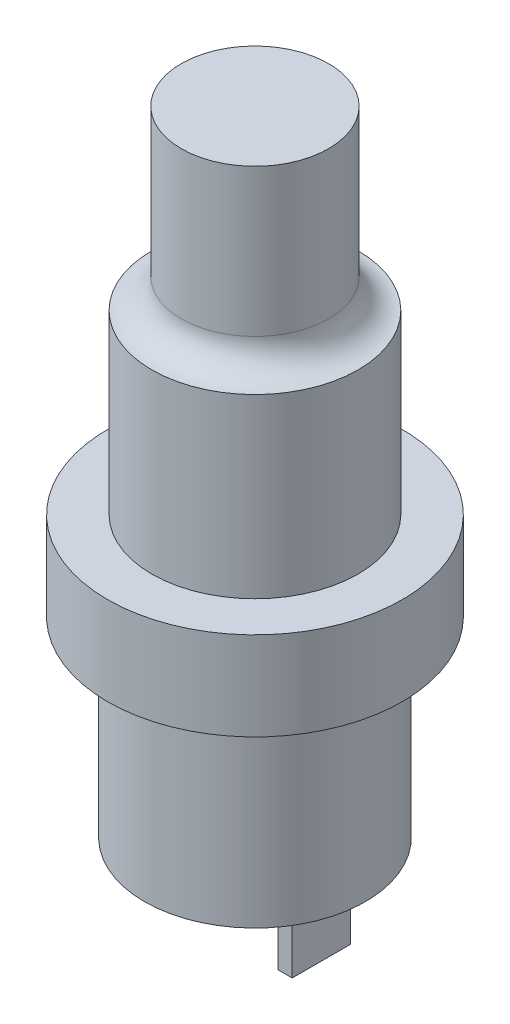
ISO-10303-21;
HEADER;
FILE_DESCRIPTION(('STEP AP214'),'2;1');
FILE_NAME('part.step','',(''),(''),'','','');
FILE_SCHEMA(('AUTOMOTIVE_DESIGN { 1 0 10303 214 1 1 1 1 }'));
ENDSEC;
DATA;
#1=APPLICATION_CONTEXT('core data for automotive mechanical design processes');
#2=APPLICATION_PROTOCOL_DEFINITION('international standard','automotive_design',2000,#1);
#3=PRODUCT_CONTEXT('',#1,'mechanical');
#4=PRODUCT('Part','Part','',(#3));
#5=PRODUCT_RELATED_PRODUCT_CATEGORY('part','',(#4));
#6=PRODUCT_DEFINITION_FORMATION('','',#4);
#7=PRODUCT_DEFINITION_CONTEXT('part definition',#1,'design');
#8=PRODUCT_DEFINITION('design','',#6,#7);
#9=PRODUCT_DEFINITION_SHAPE('','',#8);
#10=(LENGTH_UNIT() NAMED_UNIT(*) SI_UNIT(.MILLI.,.METRE.));
#11=(NAMED_UNIT(*) PLANE_ANGLE_UNIT() SI_UNIT($,.RADIAN.));
#12=(NAMED_UNIT(*) SI_UNIT($,.STERADIAN.) SOLID_ANGLE_UNIT());
#13=UNCERTAINTY_MEASURE_WITH_UNIT(LENGTH_MEASURE(1.E-05),#10,'distance_accuracy_value','');
#14=(GEOMETRIC_REPRESENTATION_CONTEXT(3) GLOBAL_UNCERTAINTY_ASSIGNED_CONTEXT((#13)) GLOBAL_UNIT_ASSIGNED_CONTEXT((#10,
#11,#12)) REPRESENTATION_CONTEXT('',''));
#15=CARTESIAN_POINT('',(0.,0.,0.));
#16=DIRECTION('',(0.,0.,1.));
#17=DIRECTION('',(1.,0.,0.));
#18=AXIS2_PLACEMENT_3D('',#15,#16,#17);
#19=CARTESIAN_POINT('',(0.,0.,0.));
#20=DIRECTION('',(0.,1.,0.));
#21=DIRECTION('',(0.,0.,1.));
#22=AXIS2_PLACEMENT_3D('',#19,#20,#21);
#23=PLANE('',#22);
#24=DIRECTION('',(0.,0.,1.));
#25=VECTOR('',#24,1.);
#26=CARTESIAN_POINT('',(-1.76643282023339,0.,0.985733097216471));
#27=LINE('',#26,#25);
#28=CARTESIAN_POINT('',(-1.76643282023339,0.,-0.985733097216471));
#29=VERTEX_POINT('',#28);
#30=CARTESIAN_POINT('',(-1.76643282023339,0.,0.985733097216471));
#31=VERTEX_POINT('',#30);
#32=EDGE_CURVE('E163',#29,#31,#27,.T.);
#33=ORIENTED_EDGE('',*,*,#32,.F.);
#34=DIRECTION('',(1.,0.,0.));
#35=VECTOR('',#34,1.);
#36=CARTESIAN_POINT('',(-1.76643282023339,0.,-0.985733097216471));
#37=LINE('',#36,#35);
#38=CARTESIAN_POINT('',(-2.25,0.,-0.985733097216471));
#39=VERTEX_POINT('',#38);
#40=EDGE_CURVE('E153',#39,#29,#37,.T.);
#41=ORIENTED_EDGE('',*,*,#40,.F.);
#42=DIRECTION('',(0.,0.,-1.));
#43=VECTOR('',#42,1.);
#44=CARTESIAN_POINT('',(-2.25,0.,0.985733097216471));
#45=LINE('',#44,#43);
#46=CARTESIAN_POINT('',(-2.25,0.,0.985733097216471));
#47=VERTEX_POINT('',#46);
#48=EDGE_CURVE('E156',#47,#39,#45,.T.);
#49=ORIENTED_EDGE('',*,*,#48,.F.);
#50=DIRECTION('',(-1.,0.,0.));
#51=VECTOR('',#50,1.);
#52=CARTESIAN_POINT('',(-1.76643282023339,0.,0.985733097216471));
#53=LINE('',#52,#51);
#54=EDGE_CURVE('E160',#31,#47,#53,.T.);
#55=ORIENTED_EDGE('',*,*,#54,.F.);
#56=EDGE_LOOP('',(#33,#41,#49,#55));
#57=FACE_BOUND('',#56,.T.);
#58=CARTESIAN_POINT('',(0.,0.,0.));
#59=DIRECTION('',(0.,1.,0.));
#60=DIRECTION('',(0.,0.,1.));
#61=AXIS2_PLACEMENT_3D('',#58,#59,#60);
#62=CIRCLE('',#61,3.75);
#63=CARTESIAN_POINT('',(0.,0.,-3.75));
#64=VERTEX_POINT('',#63);
#65=EDGE_CURVE('E182',#64,#64,#62,.T.);
#66=ORIENTED_EDGE('',*,*,#65,.F.);
#67=EDGE_LOOP('',(#66));
#68=FACE_BOUND('',#67,.T.);
#69=DIRECTION('',(0.,0.,1.));
#70=VECTOR('',#69,1.);
#71=CARTESIAN_POINT('',(2.25,0.,0.985733097216471));
#72=LINE('',#71,#70);
#73=CARTESIAN_POINT('',(2.25,0.,-0.985733097216471));
#74=VERTEX_POINT('',#73);
#75=CARTESIAN_POINT('',(2.25,0.,0.985733097216471));
#76=VERTEX_POINT('',#75);
#77=EDGE_CURVE('E130',#74,#76,#72,.T.);
#78=ORIENTED_EDGE('',*,*,#77,.F.);
#79=DIRECTION('',(1.,0.,0.));
#80=VECTOR('',#79,1.);
#81=CARTESIAN_POINT('',(1.76643282023339,0.,-0.985733097216471));
#82=LINE('',#81,#80);
#83=CARTESIAN_POINT('',(1.76643282023339,0.,-0.985733097216471));
#84=VERTEX_POINT('',#83);
#85=EDGE_CURVE('E127',#84,#74,#82,.T.);
#86=ORIENTED_EDGE('',*,*,#85,.F.);
#87=DIRECTION('',(0.,0.,-1.));
#88=VECTOR('',#87,1.);
#89=CARTESIAN_POINT('',(1.76643282023339,0.,0.985733097216471));
#90=LINE('',#89,#88);
#91=CARTESIAN_POINT('',(1.76643282023339,0.,0.985733097216471));
#92=VERTEX_POINT('',#91);
#93=EDGE_CURVE('E65',#92,#84,#90,.T.);
#94=ORIENTED_EDGE('',*,*,#93,.F.);
#95=DIRECTION('',(-1.,0.,0.));
#96=VECTOR('',#95,1.);
#97=CARTESIAN_POINT('',(1.76643282023339,0.,0.985733097216471));
#98=LINE('',#97,#96);
#99=EDGE_CURVE('E60',#76,#92,#98,.T.);
#100=ORIENTED_EDGE('',*,*,#99,.F.);
#101=EDGE_LOOP('',(#78,#86,#94,#100));
#102=FACE_BOUND('',#101,.T.);
#103=ADVANCED_FACE('F45',(#57,#68,#102),#23,.F.);
#104=CARTESIAN_POINT('',(0.,6.5,0.));
#105=DIRECTION('',(0.,-1.,0.));
#106=DIRECTION('',(0.,0.,-1.));
#107=AXIS2_PLACEMENT_3D('',#104,#105,#106);
#108=CYLINDRICAL_SURFACE('',#107,3.75);
#109=CARTESIAN_POINT('',(0.,6.5,0.));
#110=DIRECTION('',(0.,1.,0.));
#111=DIRECTION('',(0.,0.,1.));
#112=AXIS2_PLACEMENT_3D('',#109,#110,#111);
#113=CIRCLE('',#112,3.75);
#114=CARTESIAN_POINT('',(0.,6.5,-3.75));
#115=VERTEX_POINT('',#114);
#116=EDGE_CURVE('E178',#115,#115,#113,.T.);
#117=CARTESIAN_POINT('',(0.,6.5,-3.75));
#118=CARTESIAN_POINT('',(0.,6.43229166666667,-3.75));
#119=CARTESIAN_POINT('',(0.,6.36458333333333,-3.75));
#120=CARTESIAN_POINT('',(0.,6.22916666666667,-3.75));
#121=CARTESIAN_POINT('',(0.,6.16145833333333,-3.75));
#122=CARTESIAN_POINT('',(0.,6.02604166666667,-3.75));
#123=CARTESIAN_POINT('',(0.,5.95833333333333,-3.75));
#124=CARTESIAN_POINT('',(0.,5.82291666666667,-3.75));
#125=CARTESIAN_POINT('',(0.,5.75520833333333,-3.75));
#126=CARTESIAN_POINT('',(0.,5.61979166666667,-3.75));
#127=CARTESIAN_POINT('',(0.,5.55208333333333,-3.75));
#128=CARTESIAN_POINT('',(0.,5.41666666666667,-3.75));
#129=CARTESIAN_POINT('',(0.,5.34895833333333,-3.75));
#130=CARTESIAN_POINT('',(0.,5.21354166666667,-3.75));
#131=CARTESIAN_POINT('',(0.,5.14583333333333,-3.75));
#132=CARTESIAN_POINT('',(0.,5.01041666666667,-3.75));
#133=CARTESIAN_POINT('',(0.,4.94270833333333,-3.75));
#134=CARTESIAN_POINT('',(0.,4.80729166666667,-3.75));
#135=CARTESIAN_POINT('',(0.,4.73958333333333,-3.75));
#136=CARTESIAN_POINT('',(0.,4.60416666666667,-3.75));
#137=CARTESIAN_POINT('',(0.,4.53645833333333,-3.75));
#138=CARTESIAN_POINT('',(0.,4.40104166666667,-3.75));
#139=CARTESIAN_POINT('',(0.,4.33333333333333,-3.75));
#140=CARTESIAN_POINT('',(0.,4.19791666666667,-3.75));
#141=CARTESIAN_POINT('',(0.,4.13020833333333,-3.75));
#142=CARTESIAN_POINT('',(0.,3.99479166666667,-3.75));
#143=CARTESIAN_POINT('',(0.,3.92708333333333,-3.75));
#144=CARTESIAN_POINT('',(0.,3.79166666666667,-3.75));
#145=CARTESIAN_POINT('',(0.,3.72395833333333,-3.75));
#146=CARTESIAN_POINT('',(0.,3.58854166666667,-3.75));
#147=CARTESIAN_POINT('',(0.,3.52083333333333,-3.75));
#148=CARTESIAN_POINT('',(0.,3.38541666666667,-3.75));
#149=CARTESIAN_POINT('',(0.,3.31770833333333,-3.75));
#150=CARTESIAN_POINT('',(0.,3.18229166666667,-3.75));
#151=CARTESIAN_POINT('',(0.,3.11458333333333,-3.75));
#152=CARTESIAN_POINT('',(0.,2.97916666666667,-3.75));
#153=CARTESIAN_POINT('',(0.,2.91145833333333,-3.75));
#154=CARTESIAN_POINT('',(0.,2.77604166666667,-3.75));
#155=CARTESIAN_POINT('',(0.,2.70833333333333,-3.75));
#156=CARTESIAN_POINT('',(0.,2.57291666666667,-3.75));
#157=CARTESIAN_POINT('',(0.,2.50520833333333,-3.75));
#158=CARTESIAN_POINT('',(0.,2.36979166666667,-3.75));
#159=CARTESIAN_POINT('',(0.,2.30208333333333,-3.75));
#160=CARTESIAN_POINT('',(0.,2.16666666666667,-3.75));
#161=CARTESIAN_POINT('',(0.,2.09895833333333,-3.75));
#162=CARTESIAN_POINT('',(0.,1.96354166666667,-3.75));
#163=CARTESIAN_POINT('',(0.,1.89583333333333,-3.75));
#164=CARTESIAN_POINT('',(0.,1.76041666666667,-3.75));
#165=CARTESIAN_POINT('',(0.,1.69270833333333,-3.75));
#166=CARTESIAN_POINT('',(0.,1.55729166666667,-3.75));
#167=CARTESIAN_POINT('',(0.,1.48958333333333,-3.75));
#168=CARTESIAN_POINT('',(0.,1.35416666666667,-3.75));
#169=CARTESIAN_POINT('',(0.,1.28645833333333,-3.75));
#170=CARTESIAN_POINT('',(0.,1.15104166666667,-3.75));
#171=CARTESIAN_POINT('',(0.,1.08333333333333,-3.75));
#172=CARTESIAN_POINT('',(0.,0.947916666666667,-3.75));
#173=CARTESIAN_POINT('',(0.,0.880208333333333,-3.75));
#174=CARTESIAN_POINT('',(0.,0.744791666666667,-3.75));
#175=CARTESIAN_POINT('',(0.,0.677083333333333,-3.75));
#176=CARTESIAN_POINT('',(0.,0.541666666666667,-3.75));
#177=CARTESIAN_POINT('',(0.,0.473958333333333,-3.75));
#178=CARTESIAN_POINT('',(0.,0.338541666666667,-3.75));
#179=CARTESIAN_POINT('',(0.,0.270833333333334,-3.75));
#180=CARTESIAN_POINT('',(0.,0.135416666666667,-3.75));
#181=CARTESIAN_POINT('',(0.,0.0677083333333334,-3.75));
#182=CARTESIAN_POINT('',(0.,0.,-3.75));
#183=B_SPLINE_CURVE_WITH_KNOTS('',3,(#117,#118,#119,#120,#121,#122,#123,#124,#125,#126,#127,
#128,#129,#130,#131,#132,#133,#134,#135,#136,#137,#138,#139,#140,#141,#142,#143,#144,#145,#146,
#147,#148,#149,#150,#151,#152,#153,#154,#155,#156,#157,#158,#159,#160,#161,#162,#163,#164,#165,
#166,#167,#168,#169,#170,#171,#172,#173,#174,#175,#176,#177,#178,#179,#180,#181,#182),
.UNSPECIFIED.,.F.,.F.,(4,2,2,2,2,2,2,2,2,2,2,2,2,2,2,2,2,2,2,2,2,2,2,2,2,2,2,2,2,2,2,2,4),(0.,
0.203125,0.40625,0.609375000000001,0.812500000000001,1.015625,1.21875,1.421875,1.625,1.828125,
2.03125,2.234375,2.4375,2.640625,2.84375,3.046875,3.25,3.453125,3.65625,3.859375,4.0625,
4.265625,4.46875,4.671875,4.875,5.078125,5.28125,5.484375,5.6875,5.890625,6.09375,6.296875,6.5),.UNSPECIFIED.);
#184=EDGE_CURVE('BSEAM189',#115,#64,#183,.T.);
#185=ORIENTED_EDGE('',*,*,#116,.F.);
#186=ORIENTED_EDGE('',*,*,#65,.T.);
#187=ORIENTED_EDGE('',*,*,#184,.T.);
#188=ORIENTED_EDGE('',*,*,#184,.F.);
#189=EDGE_LOOP('',(#185,#187,#186,#188));
#190=FACE_BOUND('',#189,.T.);
#191=ADVANCED_FACE('F189',(#190),#108,.T.);
#192=CARTESIAN_POINT('',(0.,9.5,0.));
#193=DIRECTION('',(0.,-1.,0.));
#194=DIRECTION('',(0.,0.,-1.));
#195=AXIS2_PLACEMENT_3D('',#192,#193,#194);
#196=CYLINDRICAL_SURFACE('',#195,5.);
#197=CARTESIAN_POINT('',(0.,9.5,0.));
#198=DIRECTION('',(0.,1.,0.));
#199=DIRECTION('',(0.,0.,1.));
#200=AXIS2_PLACEMENT_3D('',#197,#198,#199);
#201=CIRCLE('',#200,5.);
#202=CARTESIAN_POINT('',(0.,9.5,5.));
#203=VERTEX_POINT('',#202);
#204=EDGE_CURVE('E179',#203,#203,#201,.T.);
#205=ORIENTED_EDGE('',*,*,#204,.F.);
#206=EDGE_LOOP('',(#205));
#207=FACE_BOUND('',#206,.T.);
#208=CARTESIAN_POINT('',(0.,6.5,0.));
#209=DIRECTION('',(0.,1.,0.));
#210=DIRECTION('',(0.,0.,1.));
#211=AXIS2_PLACEMENT_3D('',#208,#209,#210);
#212=CIRCLE('',#211,5.);
#213=CARTESIAN_POINT('',(0.,6.5,5.));
#214=VERTEX_POINT('',#213);
#215=EDGE_CURVE('E175',#214,#214,#212,.T.);
#216=ORIENTED_EDGE('',*,*,#215,.T.);
#217=EDGE_LOOP('',(#216));
#218=FACE_BOUND('',#217,.T.);
#219=ADVANCED_FACE('F257',(#207,#218),#196,.T.);
#220=CARTESIAN_POINT('',(0.,9.5,0.));
#221=DIRECTION('',(0.,1.,0.));
#222=DIRECTION('',(0.,0.,1.));
#223=AXIS2_PLACEMENT_3D('',#220,#221,#222);
#224=PLANE('',#223);
#225=CARTESIAN_POINT('',(0.,9.5,0.));
#226=DIRECTION('',(0.,1.,0.));
#227=DIRECTION('',(0.,0.,1.));
#228=AXIS2_PLACEMENT_3D('',#225,#226,#227);
#229=CIRCLE('',#228,3.5);
#230=CARTESIAN_POINT('',(0.,9.5,3.5));
#231=VERTEX_POINT('',#230);
#232=EDGE_CURVE('E53',#231,#231,#229,.T.);
#233=ORIENTED_EDGE('',*,*,#232,.F.);
#234=EDGE_LOOP('',(#233));
#235=FACE_BOUND('',#234,.T.);
#236=ORIENTED_EDGE('',*,*,#204,.T.);
#237=EDGE_LOOP('',(#236));
#238=FACE_BOUND('',#237,.T.);
#239=ADVANCED_FACE('F254',(#235,#238),#224,.T.);
#240=CARTESIAN_POINT('',(0.,6.5,0.));
#241=DIRECTION('',(0.,1.,0.));
#242=DIRECTION('',(0.,0.,1.));
#243=AXIS2_PLACEMENT_3D('',#240,#241,#242);
#244=PLANE('',#243);
#245=ORIENTED_EDGE('',*,*,#116,.T.);
#246=EDGE_LOOP('',(#245));
#247=FACE_BOUND('',#246,.T.);
#248=ORIENTED_EDGE('',*,*,#215,.F.);
#249=EDGE_LOOP('',(#248));
#250=FACE_BOUND('',#249,.T.);
#251=ADVANCED_FACE('F252',(#247,#250),#244,.F.);
#252=CARTESIAN_POINT('',(0.,15.5,0.));
#253=DIRECTION('',(0.,-1.,0.));
#254=DIRECTION('',(0.,0.,-1.));
#255=AXIS2_PLACEMENT_3D('',#252,#253,#254);
#256=CYLINDRICAL_SURFACE('',#255,3.5);
#257=CARTESIAN_POINT('',(0.,15.5,0.));
#258=DIRECTION('',(0.,1.,0.));
#259=DIRECTION('',(0.,0.,1.));
#260=AXIS2_PLACEMENT_3D('',#257,#258,#259);
#261=CIRCLE('',#260,3.5);
#262=CARTESIAN_POINT('',(0.,15.5,3.5));
#263=VERTEX_POINT('',#262);
#264=EDGE_CURVE('E134',#263,#263,#261,.T.);
#265=ORIENTED_EDGE('',*,*,#264,.F.);
#266=EDGE_LOOP('',(#265));
#267=FACE_BOUND('',#266,.T.);
#268=ORIENTED_EDGE('',*,*,#232,.T.);
#269=EDGE_LOOP('',(#268));
#270=FACE_BOUND('',#269,.T.);
#271=ADVANCED_FACE('F248',(#267,#270),#256,.T.);
#272=CARTESIAN_POINT('',(0.,21.5,0.));
#273=DIRECTION('',(0.,-1.,0.));
#274=DIRECTION('',(0.,0.,-1.));
#275=AXIS2_PLACEMENT_3D('',#272,#273,#274);
#276=CYLINDRICAL_SURFACE('',#275,2.5);
#277=CARTESIAN_POINT('',(0.,16.5,0.));
#278=DIRECTION('',(0.,1.,0.));
#279=DIRECTION('',(0.,0.,1.));
#280=AXIS2_PLACEMENT_3D('',#277,#278,#279);
#281=CIRCLE('',#280,2.5);
#282=CARTESIAN_POINT('',(0.,16.5,2.5));
#283=VERTEX_POINT('',#282);
#284=EDGE_CURVE('E11',#283,#283,#281,.T.);
#285=ORIENTED_EDGE('',*,*,#284,.T.);
#286=EDGE_LOOP('',(#285));
#287=FACE_BOUND('',#286,.T.);
#288=CARTESIAN_POINT('',(0.,21.5,0.));
#289=DIRECTION('',(0.,1.,0.));
#290=DIRECTION('',(0.,0.,1.));
#291=AXIS2_PLACEMENT_3D('',#288,#289,#290);
#292=CIRCLE('',#291,2.5);
#293=CARTESIAN_POINT('',(0.,21.5,2.5));
#294=VERTEX_POINT('',#293);
#295=EDGE_CURVE('E131',#294,#294,#292,.T.);
#296=ORIENTED_EDGE('',*,*,#295,.F.);
#297=EDGE_LOOP('',(#296));
#298=FACE_BOUND('',#297,.T.);
#299=ADVANCED_FACE('F244',(#287,#298),#276,.T.);
#300=CARTESIAN_POINT('',(0.,21.5,0.));
#301=DIRECTION('',(0.,1.,0.));
#302=DIRECTION('',(0.,0.,1.));
#303=AXIS2_PLACEMENT_3D('',#300,#301,#302);
#304=PLANE('',#303);
#305=ORIENTED_EDGE('',*,*,#295,.T.);
#306=EDGE_LOOP('',(#305));
#307=FACE_BOUND('',#306,.T.);
#308=ADVANCED_FACE('F241',(#307),#304,.T.);
#309=CARTESIAN_POINT('',(0.,16.5,0.));
#310=DIRECTION('',(0.,1.,0.));
#311=DIRECTION('',(0.,0.,1.));
#312=AXIS2_PLACEMENT_3D('',#309,#310,#311);
#313=TOROIDAL_SURFACE('',#312,3.5,1.);
#314=ORIENTED_EDGE('',*,*,#264,.T.);
#315=EDGE_LOOP('',(#314));
#316=FACE_BOUND('',#315,.T.);
#317=ORIENTED_EDGE('',*,*,#284,.F.);
#318=EDGE_LOOP('',(#317));
#319=FACE_BOUND('',#318,.T.);
#320=ADVANCED_FACE('F47',(#316,#319),#313,.F.);
#321=CARTESIAN_POINT('',(-1.76643282023339,-2.5,0.985733097216471));
#322=DIRECTION('',(-1.,0.,0.));
#323=DIRECTION('',(0.,0.,1.));
#324=AXIS2_PLACEMENT_3D('',#321,#322,#323);
#325=PLANE('',#324);
#326=ORIENTED_EDGE('',*,*,#32,.T.);
#327=DIRECTION('',(0.,1.,0.));
#328=VECTOR('',#327,1.);
#329=CARTESIAN_POINT('',(-1.76643282023339,-2.5,0.985733097216471));
#330=LINE('',#329,#328);
#331=CARTESIAN_POINT('',(-1.76643282023339,-2.5,0.985733097216471));
#332=VERTEX_POINT('',#331);
#333=EDGE_CURVE('E140',#332,#31,#330,.T.);
#334=ORIENTED_EDGE('',*,*,#333,.F.);
#335=DIRECTION('',(0.,0.,1.));
#336=VECTOR('',#335,1.);
#337=CARTESIAN_POINT('',(-1.76643282023339,-2.5,0.985733097216471));
#338=LINE('',#337,#336);
#339=CARTESIAN_POINT('',(-1.76643282023339,-2.5,-0.985733097216471));
#340=VERTEX_POINT('',#339);
#341=EDGE_CURVE('E157',#340,#332,#338,.T.);
#342=ORIENTED_EDGE('',*,*,#341,.F.);
#343=DIRECTION('',(0.,1.,0.));
#344=VECTOR('',#343,1.);
#345=CARTESIAN_POINT('',(-1.76643282023339,-2.5,-0.985733097216471));
#346=LINE('',#345,#344);
#347=EDGE_CURVE('E149',#340,#29,#346,.T.);
#348=ORIENTED_EDGE('',*,*,#347,.T.);
#349=EDGE_LOOP('',(#326,#334,#342,#348));
#350=FACE_BOUND('',#349,.T.);
#351=ADVANCED_FACE('F222',(#350),#325,.F.);
#352=CARTESIAN_POINT('',(-1.76643282023339,-2.5,0.985733097216471));
#353=DIRECTION('',(0.,0.,-1.));
#354=DIRECTION('',(-1.,0.,0.));
#355=AXIS2_PLACEMENT_3D('',#352,#353,#354);
#356=PLANE('',#355);
#357=ORIENTED_EDGE('',*,*,#54,.T.);
#358=DIRECTION('',(0.,1.,0.));
#359=VECTOR('',#358,1.);
#360=CARTESIAN_POINT('',(-2.25,-2.5,0.985733097216471));
#361=LINE('',#360,#359);
#362=CARTESIAN_POINT('',(-2.25,-2.5,0.985733097216471));
#363=VERTEX_POINT('',#362);
#364=EDGE_CURVE('E143',#363,#47,#361,.T.);
#365=ORIENTED_EDGE('',*,*,#364,.F.);
#366=DIRECTION('',(-1.,0.,0.));
#367=VECTOR('',#366,1.);
#368=CARTESIAN_POINT('',(-1.76643282023339,-2.5,0.985733097216471));
#369=LINE('',#368,#367);
#370=EDGE_CURVE('E169',#332,#363,#369,.T.);
#371=ORIENTED_EDGE('',*,*,#370,.F.);
#372=ORIENTED_EDGE('',*,*,#333,.T.);
#373=EDGE_LOOP('',(#357,#365,#371,#372));
#374=FACE_BOUND('',#373,.T.);
#375=ADVANCED_FACE('F225',(#374),#356,.F.);
#376=CARTESIAN_POINT('',(-2.25,-2.5,0.985733097216471));
#377=DIRECTION('',(1.,0.,0.));
#378=DIRECTION('',(0.,0.,-1.));
#379=AXIS2_PLACEMENT_3D('',#376,#377,#378);
#380=PLANE('',#379);
#381=ORIENTED_EDGE('',*,*,#48,.T.);
#382=DIRECTION('',(0.,1.,0.));
#383=VECTOR('',#382,1.);
#384=CARTESIAN_POINT('',(-2.25,-2.5,-0.985733097216471));
#385=LINE('',#384,#383);
#386=CARTESIAN_POINT('',(-2.25,-2.5,-0.985733097216471));
#387=VERTEX_POINT('',#386);
#388=EDGE_CURVE('E146',#387,#39,#385,.T.);
#389=ORIENTED_EDGE('',*,*,#388,.F.);
#390=DIRECTION('',(0.,0.,-1.));
#391=VECTOR('',#390,1.);
#392=CARTESIAN_POINT('',(-2.25,-2.5,0.985733097216471));
#393=LINE('',#392,#391);
#394=EDGE_CURVE('E167',#363,#387,#393,.T.);
#395=ORIENTED_EDGE('',*,*,#394,.F.);
#396=ORIENTED_EDGE('',*,*,#364,.T.);
#397=EDGE_LOOP('',(#381,#389,#395,#396));
#398=FACE_BOUND('',#397,.T.);
#399=ADVANCED_FACE('F229',(#398),#380,.F.);
#400=CARTESIAN_POINT('',(-1.76643282023339,-2.5,-0.985733097216471));
#401=DIRECTION('',(0.,0.,1.));
#402=DIRECTION('',(1.,0.,0.));
#403=AXIS2_PLACEMENT_3D('',#400,#401,#402);
#404=PLANE('',#403);
#405=ORIENTED_EDGE('',*,*,#40,.T.);
#406=ORIENTED_EDGE('',*,*,#347,.F.);
#407=DIRECTION('',(1.,0.,0.));
#408=VECTOR('',#407,1.);
#409=CARTESIAN_POINT('',(-1.76643282023339,-2.5,-0.985733097216471));
#410=LINE('',#409,#408);
#411=EDGE_CURVE('E152',#387,#340,#410,.T.);
#412=ORIENTED_EDGE('',*,*,#411,.F.);
#413=ORIENTED_EDGE('',*,*,#388,.T.);
#414=EDGE_LOOP('',(#405,#406,#412,#413));
#415=FACE_BOUND('',#414,.T.);
#416=ADVANCED_FACE('F233',(#415),#404,.F.);
#417=CARTESIAN_POINT('',(0.,-2.5,0.));
#418=DIRECTION('',(0.,1.,0.));
#419=DIRECTION('',(0.,0.,1.));
#420=AXIS2_PLACEMENT_3D('',#417,#418,#419);
#421=PLANE('',#420);
#422=ORIENTED_EDGE('',*,*,#341,.T.);
#423=ORIENTED_EDGE('',*,*,#370,.T.);
#424=ORIENTED_EDGE('',*,*,#394,.T.);
#425=ORIENTED_EDGE('',*,*,#411,.T.);
#426=EDGE_LOOP('',(#422,#423,#424,#425));
#427=FACE_BOUND('',#426,.T.);
#428=ADVANCED_FACE('F221',(#427),#421,.F.);
#429=CARTESIAN_POINT('',(2.25,-2.5,0.985733097216471));
#430=DIRECTION('',(-1.,0.,0.));
#431=DIRECTION('',(0.,0.,1.));
#432=AXIS2_PLACEMENT_3D('',#429,#430,#431);
#433=PLANE('',#432);
#434=ORIENTED_EDGE('',*,*,#77,.T.);
#435=DIRECTION('',(0.,1.,0.));
#436=VECTOR('',#435,1.);
#437=CARTESIAN_POINT('',(2.25,-2.5,0.985733097216471));
#438=LINE('',#437,#436);
#439=CARTESIAN_POINT('',(2.25,-2.5,0.985733097216471));
#440=VERTEX_POINT('',#439);
#441=EDGE_CURVE('E111',#440,#76,#438,.T.);
#442=ORIENTED_EDGE('',*,*,#441,.F.);
#443=DIRECTION('',(0.,0.,1.));
#444=VECTOR('',#443,1.);
#445=CARTESIAN_POINT('',(2.25,-2.5,0.985733097216471));
#446=LINE('',#445,#444);
#447=CARTESIAN_POINT('',(2.25,-2.5,-0.985733097216471));
#448=VERTEX_POINT('',#447);
#449=EDGE_CURVE('E118',#448,#440,#446,.T.);
#450=ORIENTED_EDGE('',*,*,#449,.F.);
#451=DIRECTION('',(0.,1.,0.));
#452=VECTOR('',#451,1.);
#453=CARTESIAN_POINT('',(2.25,-2.5,-0.985733097216471));
#454=LINE('',#453,#452);
#455=EDGE_CURVE('E199',#448,#74,#454,.T.);
#456=ORIENTED_EDGE('',*,*,#455,.T.);
#457=EDGE_LOOP('',(#434,#442,#450,#456));
#458=FACE_BOUND('',#457,.T.);
#459=ADVANCED_FACE('F129',(#458),#433,.F.);
#460=CARTESIAN_POINT('',(1.76643282023339,-2.5,0.985733097216471));
#461=DIRECTION('',(0.,0.,-1.));
#462=DIRECTION('',(-1.,0.,0.));
#463=AXIS2_PLACEMENT_3D('',#460,#461,#462);
#464=PLANE('',#463);
#465=ORIENTED_EDGE('',*,*,#99,.T.);
#466=DIRECTION('',(0.,1.,0.));
#467=VECTOR('',#466,1.);
#468=CARTESIAN_POINT('',(1.76643282023339,-2.5,0.985733097216471));
#469=LINE('',#468,#467);
#470=CARTESIAN_POINT('',(1.76643282023339,-2.5,0.985733097216471));
#471=VERTEX_POINT('',#470);
#472=EDGE_CURVE('E114',#471,#92,#469,.T.);
#473=ORIENTED_EDGE('',*,*,#472,.F.);
#474=DIRECTION('',(-1.,0.,0.));
#475=VECTOR('',#474,1.);
#476=CARTESIAN_POINT('',(1.76643282023339,-2.5,0.985733097216471));
#477=LINE('',#476,#475);
#478=EDGE_CURVE('E107',#440,#471,#477,.T.);
#479=ORIENTED_EDGE('',*,*,#478,.F.);
#480=ORIENTED_EDGE('',*,*,#441,.T.);
#481=EDGE_LOOP('',(#465,#473,#479,#480));
#482=FACE_BOUND('',#481,.T.);
#483=ADVANCED_FACE('F109',(#482),#464,.F.);
#484=CARTESIAN_POINT('',(1.76643282023339,-2.5,0.985733097216471));
#485=DIRECTION('',(1.,0.,0.));
#486=DIRECTION('',(0.,0.,-1.));
#487=AXIS2_PLACEMENT_3D('',#484,#485,#486);
#488=PLANE('',#487);
#489=ORIENTED_EDGE('',*,*,#93,.T.);
#490=DIRECTION('',(0.,1.,0.));
#491=VECTOR('',#490,1.);
#492=CARTESIAN_POINT('',(1.76643282023339,-2.5,-0.985733097216471));
#493=LINE('',#492,#491);
#494=CARTESIAN_POINT('',(1.76643282023339,-2.5,-0.985733097216471));
#495=VERTEX_POINT('',#494);
#496=EDGE_CURVE('E136',#495,#84,#493,.T.);
#497=ORIENTED_EDGE('',*,*,#496,.F.);
#498=DIRECTION('',(0.,0.,-1.));
#499=VECTOR('',#498,1.);
#500=CARTESIAN_POINT('',(1.76643282023339,-2.5,0.985733097216471));
#501=LINE('',#500,#499);
#502=EDGE_CURVE('E117',#471,#495,#501,.T.);
#503=ORIENTED_EDGE('',*,*,#502,.F.);
#504=ORIENTED_EDGE('',*,*,#472,.T.);
#505=EDGE_LOOP('',(#489,#497,#503,#504));
#506=FACE_BOUND('',#505,.T.);
#507=ADVANCED_FACE('F208',(#506),#488,.F.);
#508=CARTESIAN_POINT('',(1.76643282023339,-2.5,-0.985733097216471));
#509=DIRECTION('',(0.,0.,1.));
#510=DIRECTION('',(1.,0.,0.));
#511=AXIS2_PLACEMENT_3D('',#508,#509,#510);
#512=PLANE('',#511);
#513=ORIENTED_EDGE('',*,*,#85,.T.);
#514=ORIENTED_EDGE('',*,*,#455,.F.);
#515=DIRECTION('',(1.,0.,0.));
#516=VECTOR('',#515,1.);
#517=CARTESIAN_POINT('',(1.76643282023339,-2.5,-0.985733097216471));
#518=LINE('',#517,#516);
#519=EDGE_CURVE('E123',#495,#448,#518,.T.);
#520=ORIENTED_EDGE('',*,*,#519,.F.);
#521=ORIENTED_EDGE('',*,*,#496,.T.);
#522=EDGE_LOOP('',(#513,#514,#520,#521));
#523=FACE_BOUND('',#522,.T.);
#524=ADVANCED_FACE('F198',(#523),#512,.F.);
#525=CARTESIAN_POINT('',(0.,-2.5,0.));
#526=DIRECTION('',(0.,-1.,0.));
#527=DIRECTION('',(0.,0.,-1.));
#528=AXIS2_PLACEMENT_3D('',#525,#526,#527);
#529=PLANE('',#528);
#530=ORIENTED_EDGE('',*,*,#449,.T.);
#531=ORIENTED_EDGE('',*,*,#478,.T.);
#532=ORIENTED_EDGE('',*,*,#502,.T.);
#533=ORIENTED_EDGE('',*,*,#519,.T.);
#534=EDGE_LOOP('',(#530,#531,#532,#533));
#535=FACE_BOUND('',#534,.T.);
#536=ADVANCED_FACE('F121',(#535),#529,.T.);
#537=CLOSED_SHELL('',(#103,#191,#219,#239,#251,#271,#299,#308,#320,#351,#375,#399,#416,#428,
#459,#483,#507,#524,#536));
#538=MANIFOLD_SOLID_BREP('B2',#537);
#539=ADVANCED_BREP_SHAPE_REPRESENTATION('',(#18,#538),#14);
#540=SHAPE_DEFINITION_REPRESENTATION(#9,#539);
ENDSEC;
END-ISO-10303-21;
